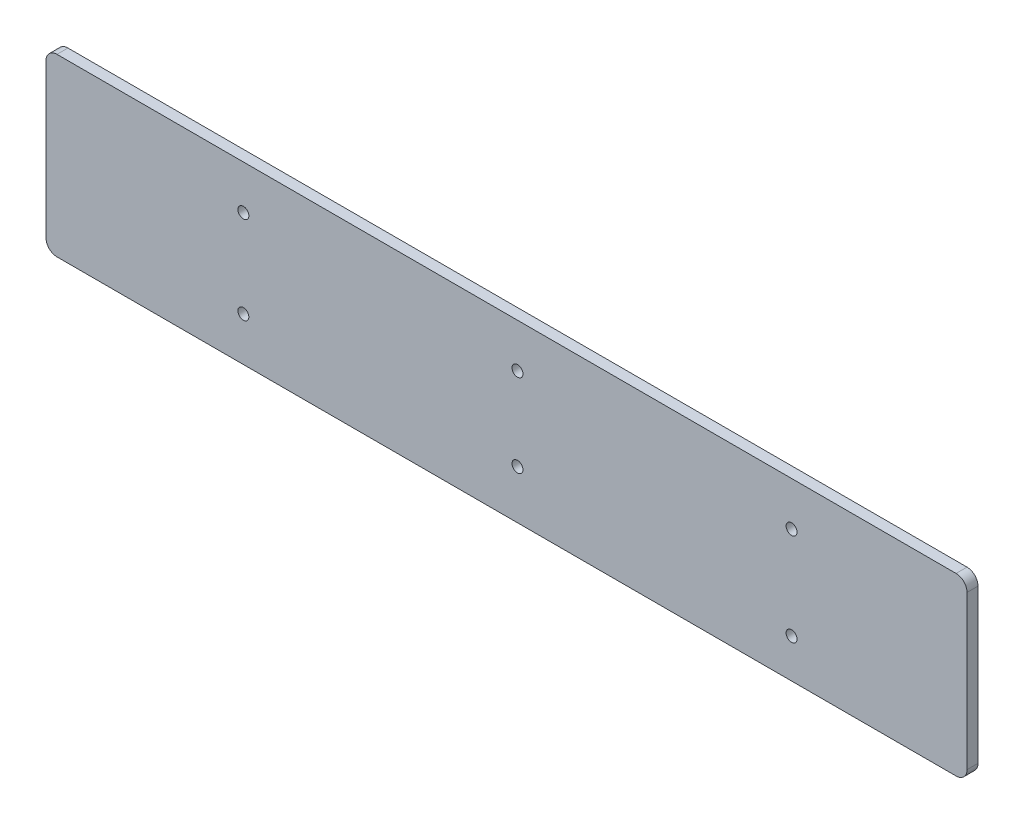
ISO-10303-21;
HEADER;
FILE_DESCRIPTION(('STEP AP214'),'2;1');
FILE_NAME('part.step','',(''),(''),'','','');
FILE_SCHEMA(('AUTOMOTIVE_DESIGN { 1 0 10303 214 1 1 1 1 }'));
ENDSEC;
DATA;
#1=APPLICATION_CONTEXT('core data for automotive mechanical design processes');
#2=APPLICATION_PROTOCOL_DEFINITION('international standard','automotive_design',2000,#1);
#3=PRODUCT_CONTEXT('',#1,'mechanical');
#4=PRODUCT('Part','Part','',(#3));
#5=PRODUCT_RELATED_PRODUCT_CATEGORY('part','',(#4));
#6=PRODUCT_DEFINITION_FORMATION('','',#4);
#7=PRODUCT_DEFINITION_CONTEXT('part definition',#1,'design');
#8=PRODUCT_DEFINITION('design','',#6,#7);
#9=PRODUCT_DEFINITION_SHAPE('','',#8);
#10=(LENGTH_UNIT() NAMED_UNIT(*) SI_UNIT(.MILLI.,.METRE.));
#11=(NAMED_UNIT(*) PLANE_ANGLE_UNIT() SI_UNIT($,.RADIAN.));
#12=(NAMED_UNIT(*) SI_UNIT($,.STERADIAN.) SOLID_ANGLE_UNIT());
#13=UNCERTAINTY_MEASURE_WITH_UNIT(LENGTH_MEASURE(1.E-05),#10,'distance_accuracy_value','');
#14=(GEOMETRIC_REPRESENTATION_CONTEXT(3) GLOBAL_UNCERTAINTY_ASSIGNED_CONTEXT((#13)) GLOBAL_UNIT_ASSIGNED_CONTEXT((#10,
#11,#12)) REPRESENTATION_CONTEXT('',''));
#15=CARTESIAN_POINT('',(0.,0.,0.));
#16=DIRECTION('',(0.,0.,1.));
#17=DIRECTION('',(1.,0.,0.));
#18=AXIS2_PLACEMENT_3D('',#15,#16,#17);
#19=CARTESIAN_POINT('',(0.,0.,5.));
#20=DIRECTION('',(0.,0.,1.));
#21=DIRECTION('',(1.,0.,0.));
#22=AXIS2_PLACEMENT_3D('',#19,#20,#21);
#23=PLANE('',#22);
#24=CARTESIAN_POINT('',(127.5093021123,8.85577866508089,5.));
#25=DIRECTION('',(0.,0.,1.));
#26=DIRECTION('',(1.,0.,0.));
#27=AXIS2_PLACEMENT_3D('',#24,#25,#26);
#28=CIRCLE('',#27,2.5);
#29=CARTESIAN_POINT('',(130.0093021123,8.85577866508089,5.));
#30=VERTEX_POINT('',#29);
#31=EDGE_CURVE('E195',#30,#30,#28,.T.);
#32=ORIENTED_EDGE('',*,*,#31,.F.);
#33=EDGE_LOOP('',(#32));
#34=FACE_BOUND('',#33,.T.);
#35=CARTESIAN_POINT('',(2.50930211230035,8.85577866508089,5.));
#36=DIRECTION('',(0.,0.,1.));
#37=DIRECTION('',(1.,0.,0.));
#38=AXIS2_PLACEMENT_3D('',#35,#36,#37);
#39=CIRCLE('',#38,2.49999999999999);
#40=CARTESIAN_POINT('',(5.00930211230035,8.85577866508089,5.));
#41=VERTEX_POINT('',#40);
#42=EDGE_CURVE('E183',#41,#41,#39,.T.);
#43=ORIENTED_EDGE('',*,*,#42,.F.);
#44=EDGE_LOOP('',(#43));
#45=FACE_BOUND('',#44,.T.);
#46=CARTESIAN_POINT('',(-122.4906978877,-31.1442213349191,5.));
#47=DIRECTION('',(0.,0.,1.));
#48=DIRECTION('',(1.,0.,0.));
#49=AXIS2_PLACEMENT_3D('',#46,#47,#48);
#50=CIRCLE('',#49,2.5);
#51=CARTESIAN_POINT('',(-119.9906978877,-31.1442213349191,5.));
#52=VERTEX_POINT('',#51);
#53=EDGE_CURVE('E166',#52,#52,#50,.T.);
#54=ORIENTED_EDGE('',*,*,#53,.F.);
#55=EDGE_LOOP('',(#54));
#56=FACE_BOUND('',#55,.T.);
#57=DIRECTION('',(1.,0.,0.));
#58=VECTOR('',#57,1.);
#59=CARTESIAN_POINT('',(207.5093021123,-51.1442213349191,5.));
#60=LINE('',#59,#58);
#61=CARTESIAN_POINT('',(-207.4906978877,-51.1442213349191,5.));
#62=VERTEX_POINT('',#61);
#63=CARTESIAN_POINT('',(202.5093021123,-51.1442213349191,5.));
#64=VERTEX_POINT('',#63);
#65=EDGE_CURVE('E173',#62,#64,#60,.T.);
#66=ORIENTED_EDGE('',*,*,#65,.T.);
#67=CARTESIAN_POINT('',(202.5093021123,-46.1442213349191,5.));
#68=DIRECTION('',(0.,0.,1.));
#69=DIRECTION('',(1.,0.,0.));
#70=AXIS2_PLACEMENT_3D('',#67,#68,#69);
#71=CIRCLE('',#70,5.);
#72=CARTESIAN_POINT('',(207.5093021123,-46.1442213349191,5.));
#73=VERTEX_POINT('',#72);
#74=EDGE_CURVE('E150',#64,#73,#71,.T.);
#75=ORIENTED_EDGE('',*,*,#74,.T.);
#76=DIRECTION('',(0.,1.,0.));
#77=VECTOR('',#76,1.);
#78=CARTESIAN_POINT('',(207.5093021123,-51.1442213349191,5.));
#79=LINE('',#78,#77);
#80=CARTESIAN_POINT('',(207.5093021123,23.8557786650809,5.));
#81=VERTEX_POINT('',#80);
#82=EDGE_CURVE('E120',#73,#81,#79,.T.);
#83=ORIENTED_EDGE('',*,*,#82,.T.);
#84=CARTESIAN_POINT('',(202.5093021123,23.8557786650809,5.));
#85=DIRECTION('',(0.,0.,1.));
#86=DIRECTION('',(1.,0.,0.));
#87=AXIS2_PLACEMENT_3D('',#84,#85,#86);
#88=CIRCLE('',#87,5.);
#89=CARTESIAN_POINT('',(202.5093021123,28.8557786650809,5.));
#90=VERTEX_POINT('',#89);
#91=EDGE_CURVE('E57',#81,#90,#88,.T.);
#92=ORIENTED_EDGE('',*,*,#91,.T.);
#93=DIRECTION('',(-1.,0.,0.));
#94=VECTOR('',#93,1.);
#95=CARTESIAN_POINT('',(207.5093021123,28.8557786650809,5.));
#96=LINE('',#95,#94);
#97=CARTESIAN_POINT('',(-207.4906978877,28.8557786650809,5.));
#98=VERTEX_POINT('',#97);
#99=EDGE_CURVE('E136',#90,#98,#96,.T.);
#100=ORIENTED_EDGE('',*,*,#99,.T.);
#101=CARTESIAN_POINT('',(-207.4906978877,23.8557786650809,5.));
#102=DIRECTION('',(0.,0.,1.));
#103=DIRECTION('',(1.,0.,0.));
#104=AXIS2_PLACEMENT_3D('',#101,#102,#103);
#105=CIRCLE('',#104,5.);
#106=CARTESIAN_POINT('',(-212.4906978877,23.8557786650809,5.));
#107=VERTEX_POINT('',#106);
#108=EDGE_CURVE('E145',#98,#107,#105,.T.);
#109=ORIENTED_EDGE('',*,*,#108,.T.);
#110=DIRECTION('',(0.,-1.,0.));
#111=VECTOR('',#110,1.);
#112=CARTESIAN_POINT('',(-212.4906978877,-51.1442213349191,5.));
#113=LINE('',#112,#111);
#114=CARTESIAN_POINT('',(-212.4906978877,-46.1442213349191,5.));
#115=VERTEX_POINT('',#114);
#116=EDGE_CURVE('E130',#107,#115,#113,.T.);
#117=ORIENTED_EDGE('',*,*,#116,.T.);
#118=CARTESIAN_POINT('',(-207.4906978877,-46.1442213349191,5.));
#119=DIRECTION('',(0.,0.,1.));
#120=DIRECTION('',(1.,0.,0.));
#121=AXIS2_PLACEMENT_3D('',#118,#119,#120);
#122=CIRCLE('',#121,5.);
#123=EDGE_CURVE('E147',#115,#62,#122,.T.);
#124=ORIENTED_EDGE('',*,*,#123,.T.);
#125=EDGE_LOOP('',(#66,#75,#83,#92,#100,#109,#117,#124));
#126=FACE_BOUND('',#125,.T.);
#127=CARTESIAN_POINT('',(-122.4906978877,8.85577866508089,5.));
#128=DIRECTION('',(0.,0.,1.));
#129=DIRECTION('',(1.,0.,0.));
#130=AXIS2_PLACEMENT_3D('',#127,#128,#129);
#131=CIRCLE('',#130,2.5);
#132=CARTESIAN_POINT('',(-119.9906978877,8.85577866508089,5.));
#133=VERTEX_POINT('',#132);
#134=EDGE_CURVE('E178',#133,#133,#131,.T.);
#135=ORIENTED_EDGE('',*,*,#134,.F.);
#136=EDGE_LOOP('',(#135));
#137=FACE_BOUND('',#136,.T.);
#138=CARTESIAN_POINT('',(2.50930211230035,-28.9787694783695,5.));
#139=DIRECTION('',(0.,0.,1.));
#140=DIRECTION('',(1.,0.,0.));
#141=AXIS2_PLACEMENT_3D('',#138,#139,#140);
#142=CIRCLE('',#141,2.49999999999999);
#143=CARTESIAN_POINT('',(5.00930211230035,-28.9787694783695,5.));
#144=VERTEX_POINT('',#143);
#145=EDGE_CURVE('E189',#144,#144,#142,.T.);
#146=ORIENTED_EDGE('',*,*,#145,.F.);
#147=EDGE_LOOP('',(#146));
#148=FACE_BOUND('',#147,.T.);
#149=CARTESIAN_POINT('',(127.5093021123,-33.3611786770105,5.));
#150=DIRECTION('',(0.,0.,1.));
#151=DIRECTION('',(1.,0.,0.));
#152=AXIS2_PLACEMENT_3D('',#149,#150,#151);
#153=CIRCLE('',#152,2.5);
#154=CARTESIAN_POINT('',(130.0093021123,-33.3611786770105,5.));
#155=VERTEX_POINT('',#154);
#156=EDGE_CURVE('E201',#155,#155,#153,.T.);
#157=ORIENTED_EDGE('',*,*,#156,.F.);
#158=EDGE_LOOP('',(#157));
#159=FACE_BOUND('',#158,.T.);
#160=ADVANCED_FACE('F35',(#34,#45,#56,#126,#137,#148,#159),#23,.T.);
#161=CARTESIAN_POINT('',(0.,0.,0.));
#162=DIRECTION('',(0.,0.,1.));
#163=DIRECTION('',(1.,0.,0.));
#164=AXIS2_PLACEMENT_3D('',#161,#162,#163);
#165=PLANE('',#164);
#166=DIRECTION('',(0.,1.,0.));
#167=VECTOR('',#166,1.);
#168=CARTESIAN_POINT('',(207.5093021123,-51.1442213349191,0.));
#169=LINE('',#168,#167);
#170=CARTESIAN_POINT('',(207.5093021123,-46.1442213349191,0.));
#171=VERTEX_POINT('',#170);
#172=CARTESIAN_POINT('',(207.5093021123,23.8557786650809,0.));
#173=VERTEX_POINT('',#172);
#174=EDGE_CURVE('E118',#171,#173,#169,.T.);
#175=ORIENTED_EDGE('',*,*,#174,.F.);
#176=CARTESIAN_POINT('',(202.5093021123,-46.1442213349191,0.));
#177=DIRECTION('',(0.,0.,1.));
#178=DIRECTION('',(1.,0.,0.));
#179=AXIS2_PLACEMENT_3D('',#176,#177,#178);
#180=CIRCLE('',#179,5.);
#181=CARTESIAN_POINT('',(202.5093021123,-51.1442213349191,0.));
#182=VERTEX_POINT('',#181);
#183=EDGE_CURVE('E101',#171,#182,#180,.F.);
#184=ORIENTED_EDGE('',*,*,#183,.T.);
#185=DIRECTION('',(1.,0.,0.));
#186=VECTOR('',#185,1.);
#187=CARTESIAN_POINT('',(207.5093021123,-51.1442213349191,0.));
#188=LINE('',#187,#186);
#189=CARTESIAN_POINT('',(-207.4906978877,-51.1442213349191,0.));
#190=VERTEX_POINT('',#189);
#191=EDGE_CURVE('E128',#190,#182,#188,.T.);
#192=ORIENTED_EDGE('',*,*,#191,.F.);
#193=CARTESIAN_POINT('',(-207.4906978877,-46.1442213349191,0.));
#194=DIRECTION('',(0.,0.,1.));
#195=DIRECTION('',(1.,0.,0.));
#196=AXIS2_PLACEMENT_3D('',#193,#194,#195);
#197=CIRCLE('',#196,5.);
#198=CARTESIAN_POINT('',(-212.4906978877,-46.1442213349191,0.));
#199=VERTEX_POINT('',#198);
#200=EDGE_CURVE('E139',#190,#199,#197,.F.);
#201=ORIENTED_EDGE('',*,*,#200,.T.);
#202=DIRECTION('',(0.,-1.,0.));
#203=VECTOR('',#202,1.);
#204=CARTESIAN_POINT('',(-212.4906978877,-51.1442213349191,0.));
#205=LINE('',#204,#203);
#206=CARTESIAN_POINT('',(-212.4906978877,23.8557786650809,0.));
#207=VERTEX_POINT('',#206);
#208=EDGE_CURVE('E132',#207,#199,#205,.T.);
#209=ORIENTED_EDGE('',*,*,#208,.F.);
#210=CARTESIAN_POINT('',(-207.4906978877,23.8557786650809,0.));
#211=DIRECTION('',(0.,0.,1.));
#212=DIRECTION('',(1.,0.,0.));
#213=AXIS2_PLACEMENT_3D('',#210,#211,#212);
#214=CIRCLE('',#213,5.);
#215=CARTESIAN_POINT('',(-207.4906978877,28.8557786650809,0.));
#216=VERTEX_POINT('',#215);
#217=EDGE_CURVE('E121',#207,#216,#214,.F.);
#218=ORIENTED_EDGE('',*,*,#217,.T.);
#219=DIRECTION('',(-1.,0.,0.));
#220=VECTOR('',#219,1.);
#221=CARTESIAN_POINT('',(207.5093021123,28.8557786650809,0.));
#222=LINE('',#221,#220);
#223=CARTESIAN_POINT('',(202.5093021123,28.8557786650809,0.));
#224=VERTEX_POINT('',#223);
#225=EDGE_CURVE('E127',#224,#216,#222,.T.);
#226=ORIENTED_EDGE('',*,*,#225,.F.);
#227=CARTESIAN_POINT('',(202.5093021123,23.8557786650809,0.));
#228=DIRECTION('',(0.,0.,1.));
#229=DIRECTION('',(1.,0.,0.));
#230=AXIS2_PLACEMENT_3D('',#227,#228,#229);
#231=CIRCLE('',#230,5.);
#232=EDGE_CURVE('E112',#224,#173,#231,.F.);
#233=ORIENTED_EDGE('',*,*,#232,.T.);
#234=EDGE_LOOP('',(#175,#184,#192,#201,#209,#218,#226,#233));
#235=FACE_BOUND('',#234,.T.);
#236=CARTESIAN_POINT('',(-122.4906978877,-31.1442213349191,0.));
#237=DIRECTION('',(0.,0.,1.));
#238=DIRECTION('',(1.,0.,0.));
#239=AXIS2_PLACEMENT_3D('',#236,#237,#238);
#240=CIRCLE('',#239,2.5);
#241=CARTESIAN_POINT('',(-119.9906978877,-31.1442213349191,0.));
#242=VERTEX_POINT('',#241);
#243=EDGE_CURVE('E168',#242,#242,#240,.T.);
#244=ORIENTED_EDGE('',*,*,#243,.T.);
#245=EDGE_LOOP('',(#244));
#246=FACE_BOUND('',#245,.T.);
#247=CARTESIAN_POINT('',(-122.4906978877,8.85577866508089,0.));
#248=DIRECTION('',(0.,0.,1.));
#249=DIRECTION('',(1.,0.,0.));
#250=AXIS2_PLACEMENT_3D('',#247,#248,#249);
#251=CIRCLE('',#250,2.5);
#252=CARTESIAN_POINT('',(-119.9906978877,8.85577866508089,0.));
#253=VERTEX_POINT('',#252);
#254=EDGE_CURVE('E180',#253,#253,#251,.T.);
#255=ORIENTED_EDGE('',*,*,#254,.T.);
#256=EDGE_LOOP('',(#255));
#257=FACE_BOUND('',#256,.T.);
#258=CARTESIAN_POINT('',(2.50930211230035,8.85577866508089,0.));
#259=DIRECTION('',(0.,0.,1.));
#260=DIRECTION('',(1.,0.,0.));
#261=AXIS2_PLACEMENT_3D('',#258,#259,#260);
#262=CIRCLE('',#261,2.49999999999999);
#263=CARTESIAN_POINT('',(5.00930211230035,8.85577866508089,0.));
#264=VERTEX_POINT('',#263);
#265=EDGE_CURVE('E186',#264,#264,#262,.T.);
#266=ORIENTED_EDGE('',*,*,#265,.T.);
#267=EDGE_LOOP('',(#266));
#268=FACE_BOUND('',#267,.T.);
#269=CARTESIAN_POINT('',(2.50930211230035,-28.9787694783695,0.));
#270=DIRECTION('',(0.,0.,1.));
#271=DIRECTION('',(1.,0.,0.));
#272=AXIS2_PLACEMENT_3D('',#269,#270,#271);
#273=CIRCLE('',#272,2.49999999999999);
#274=CARTESIAN_POINT('',(5.00930211230035,-28.9787694783695,0.));
#275=VERTEX_POINT('',#274);
#276=EDGE_CURVE('E192',#275,#275,#273,.T.);
#277=ORIENTED_EDGE('',*,*,#276,.T.);
#278=EDGE_LOOP('',(#277));
#279=FACE_BOUND('',#278,.T.);
#280=CARTESIAN_POINT('',(127.5093021123,8.85577866508089,0.));
#281=DIRECTION('',(0.,0.,1.));
#282=DIRECTION('',(1.,0.,0.));
#283=AXIS2_PLACEMENT_3D('',#280,#281,#282);
#284=CIRCLE('',#283,2.5);
#285=CARTESIAN_POINT('',(130.0093021123,8.85577866508089,0.));
#286=VERTEX_POINT('',#285);
#287=EDGE_CURVE('E198',#286,#286,#284,.T.);
#288=ORIENTED_EDGE('',*,*,#287,.T.);
#289=EDGE_LOOP('',(#288));
#290=FACE_BOUND('',#289,.T.);
#291=CARTESIAN_POINT('',(127.5093021123,-33.3611786770105,0.));
#292=DIRECTION('',(0.,0.,1.));
#293=DIRECTION('',(1.,0.,0.));
#294=AXIS2_PLACEMENT_3D('',#291,#292,#293);
#295=CIRCLE('',#294,2.5);
#296=CARTESIAN_POINT('',(130.0093021123,-33.3611786770105,0.));
#297=VERTEX_POINT('',#296);
#298=EDGE_CURVE('E204',#297,#297,#295,.T.);
#299=ORIENTED_EDGE('',*,*,#298,.T.);
#300=EDGE_LOOP('',(#299));
#301=FACE_BOUND('',#300,.T.);
#302=ADVANCED_FACE('F124',(#235,#246,#257,#268,#279,#290,#301),#165,.F.);
#303=CARTESIAN_POINT('',(-212.4906978877,-51.1442213349191,5.));
#304=DIRECTION('',(1.,0.,0.));
#305=DIRECTION('',(0.,0.,-1.));
#306=AXIS2_PLACEMENT_3D('',#303,#304,#305);
#307=PLANE('',#306);
#308=ORIENTED_EDGE('',*,*,#208,.T.);
#309=DIRECTION('',(0.,0.,-1.));
#310=VECTOR('',#309,1.);
#311=CARTESIAN_POINT('',(-212.4906978877,-46.1442213349191,5.));
#312=LINE('',#311,#310);
#313=EDGE_CURVE('E11',#199,#115,#312,.F.);
#314=ORIENTED_EDGE('',*,*,#313,.T.);
#315=ORIENTED_EDGE('',*,*,#116,.F.);
#316=DIRECTION('',(0.,0.,-1.));
#317=VECTOR('',#316,1.);
#318=CARTESIAN_POINT('',(-212.4906978877,23.8557786650809,5.));
#319=LINE('',#318,#317);
#320=EDGE_CURVE('E43',#107,#207,#319,.T.);
#321=ORIENTED_EDGE('',*,*,#320,.T.);
#322=EDGE_LOOP('',(#308,#314,#315,#321));
#323=FACE_BOUND('',#322,.T.);
#324=ADVANCED_FACE('F161',(#323),#307,.F.);
#325=CARTESIAN_POINT('',(207.5093021123,-51.1442213349191,5.));
#326=DIRECTION('',(0.,1.,0.));
#327=DIRECTION('',(-1.,0.,0.));
#328=AXIS2_PLACEMENT_3D('',#325,#326,#327);
#329=PLANE('',#328);
#330=ORIENTED_EDGE('',*,*,#191,.T.);
#331=DIRECTION('',(0.,0.,-1.));
#332=VECTOR('',#331,1.);
#333=CARTESIAN_POINT('',(202.5093021123,-51.1442213349191,5.));
#334=LINE('',#333,#332);
#335=EDGE_CURVE('E106',#182,#64,#334,.F.);
#336=ORIENTED_EDGE('',*,*,#335,.T.);
#337=ORIENTED_EDGE('',*,*,#65,.F.);
#338=DIRECTION('',(0.,0.,-1.));
#339=VECTOR('',#338,1.);
#340=CARTESIAN_POINT('',(-207.4906978877,-51.1442213349191,5.));
#341=LINE('',#340,#339);
#342=EDGE_CURVE('E111',#62,#190,#341,.T.);
#343=ORIENTED_EDGE('',*,*,#342,.T.);
#344=EDGE_LOOP('',(#330,#336,#337,#343));
#345=FACE_BOUND('',#344,.T.);
#346=ADVANCED_FACE('F231',(#345),#329,.F.);
#347=CARTESIAN_POINT('',(207.5093021123,-51.1442213349191,5.));
#348=DIRECTION('',(-1.,0.,0.));
#349=DIRECTION('',(0.,-1.,0.));
#350=AXIS2_PLACEMENT_3D('',#347,#348,#349);
#351=PLANE('',#350);
#352=ORIENTED_EDGE('',*,*,#82,.F.);
#353=DIRECTION('',(0.,0.,-1.));
#354=VECTOR('',#353,1.);
#355=CARTESIAN_POINT('',(207.5093021123,-46.1442213349191,5.));
#356=LINE('',#355,#354);
#357=EDGE_CURVE('E105',#73,#171,#356,.T.);
#358=ORIENTED_EDGE('',*,*,#357,.T.);
#359=ORIENTED_EDGE('',*,*,#174,.T.);
#360=DIRECTION('',(0.,0.,-1.));
#361=VECTOR('',#360,1.);
#362=CARTESIAN_POINT('',(207.5093021123,23.8557786650809,5.));
#363=LINE('',#362,#361);
#364=EDGE_CURVE('E122',#173,#81,#363,.F.);
#365=ORIENTED_EDGE('',*,*,#364,.T.);
#366=EDGE_LOOP('',(#352,#358,#359,#365));
#367=FACE_BOUND('',#366,.T.);
#368=ADVANCED_FACE('F117',(#367),#351,.F.);
#369=CARTESIAN_POINT('',(207.5093021123,28.8557786650809,5.));
#370=DIRECTION('',(0.,-1.,0.));
#371=DIRECTION('',(0.,0.,-1.));
#372=AXIS2_PLACEMENT_3D('',#369,#370,#371);
#373=PLANE('',#372);
#374=ORIENTED_EDGE('',*,*,#99,.F.);
#375=DIRECTION('',(0.,0.,-1.));
#376=VECTOR('',#375,1.);
#377=CARTESIAN_POINT('',(202.5093021123,28.8557786650809,5.));
#378=LINE('',#377,#376);
#379=EDGE_CURVE('E153',#90,#224,#378,.T.);
#380=ORIENTED_EDGE('',*,*,#379,.T.);
#381=ORIENTED_EDGE('',*,*,#225,.T.);
#382=DIRECTION('',(0.,0.,-1.));
#383=VECTOR('',#382,1.);
#384=CARTESIAN_POINT('',(-207.4906978877,28.8557786650809,5.));
#385=LINE('',#384,#383);
#386=EDGE_CURVE('E50',#216,#98,#385,.F.);
#387=ORIENTED_EDGE('',*,*,#386,.T.);
#388=EDGE_LOOP('',(#374,#380,#381,#387));
#389=FACE_BOUND('',#388,.T.);
#390=ADVANCED_FACE('F226',(#389),#373,.F.);
#391=CARTESIAN_POINT('',(-122.4906978877,-31.1442213349191,5.));
#392=DIRECTION('',(0.,0.,-1.));
#393=DIRECTION('',(-1.,0.,0.));
#394=AXIS2_PLACEMENT_3D('',#391,#392,#393);
#395=CYLINDRICAL_SURFACE('',#394,2.5);
#396=ORIENTED_EDGE('',*,*,#53,.T.);
#397=EDGE_LOOP('',(#396));
#398=FACE_BOUND('',#397,.T.);
#399=ORIENTED_EDGE('',*,*,#243,.F.);
#400=EDGE_LOOP('',(#399));
#401=FACE_BOUND('',#400,.T.);
#402=ADVANCED_FACE('F223',(#398,#401),#395,.F.);
#403=CARTESIAN_POINT('',(-122.4906978877,8.85577866508089,5.));
#404=DIRECTION('',(0.,0.,-1.));
#405=DIRECTION('',(-1.,0.,0.));
#406=AXIS2_PLACEMENT_3D('',#403,#404,#405);
#407=CYLINDRICAL_SURFACE('',#406,2.5);
#408=ORIENTED_EDGE('',*,*,#134,.T.);
#409=EDGE_LOOP('',(#408));
#410=FACE_BOUND('',#409,.T.);
#411=ORIENTED_EDGE('',*,*,#254,.F.);
#412=EDGE_LOOP('',(#411));
#413=FACE_BOUND('',#412,.T.);
#414=ADVANCED_FACE('F278',(#410,#413),#407,.F.);
#415=CARTESIAN_POINT('',(2.50930211230035,8.85577866508089,5.));
#416=DIRECTION('',(0.,0.,-1.));
#417=DIRECTION('',(-1.,0.,0.));
#418=AXIS2_PLACEMENT_3D('',#415,#416,#417);
#419=CYLINDRICAL_SURFACE('',#418,2.49999999999999);
#420=ORIENTED_EDGE('',*,*,#42,.T.);
#421=EDGE_LOOP('',(#420));
#422=FACE_BOUND('',#421,.T.);
#423=ORIENTED_EDGE('',*,*,#265,.F.);
#424=EDGE_LOOP('',(#423));
#425=FACE_BOUND('',#424,.T.);
#426=ADVANCED_FACE('F261',(#422,#425),#419,.F.);
#427=CARTESIAN_POINT('',(2.50930211230035,-28.9787694783695,5.));
#428=DIRECTION('',(0.,0.,-1.));
#429=DIRECTION('',(-1.,0.,0.));
#430=AXIS2_PLACEMENT_3D('',#427,#428,#429);
#431=CYLINDRICAL_SURFACE('',#430,2.49999999999999);
#432=ORIENTED_EDGE('',*,*,#145,.T.);
#433=EDGE_LOOP('',(#432));
#434=FACE_BOUND('',#433,.T.);
#435=ORIENTED_EDGE('',*,*,#276,.F.);
#436=EDGE_LOOP('',(#435));
#437=FACE_BOUND('',#436,.T.);
#438=ADVANCED_FACE('F257',(#434,#437),#431,.F.);
#439=CARTESIAN_POINT('',(127.5093021123,8.85577866508089,5.));
#440=DIRECTION('',(0.,0.,-1.));
#441=DIRECTION('',(-1.,0.,0.));
#442=AXIS2_PLACEMENT_3D('',#439,#440,#441);
#443=CYLINDRICAL_SURFACE('',#442,2.5);
#444=ORIENTED_EDGE('',*,*,#31,.T.);
#445=EDGE_LOOP('',(#444));
#446=FACE_BOUND('',#445,.T.);
#447=ORIENTED_EDGE('',*,*,#287,.F.);
#448=EDGE_LOOP('',(#447));
#449=FACE_BOUND('',#448,.T.);
#450=ADVANCED_FACE('F260',(#446,#449),#443,.F.);
#451=CARTESIAN_POINT('',(127.5093021123,-33.3611786770105,5.));
#452=DIRECTION('',(0.,0.,-1.));
#453=DIRECTION('',(-1.,0.,0.));
#454=AXIS2_PLACEMENT_3D('',#451,#452,#453);
#455=CYLINDRICAL_SURFACE('',#454,2.5);
#456=ORIENTED_EDGE('',*,*,#156,.T.);
#457=EDGE_LOOP('',(#456));
#458=FACE_BOUND('',#457,.T.);
#459=ORIENTED_EDGE('',*,*,#298,.F.);
#460=EDGE_LOOP('',(#459));
#461=FACE_BOUND('',#460,.T.);
#462=ADVANCED_FACE('F210',(#458,#461),#455,.F.);
#463=CARTESIAN_POINT('',(202.5093021123,-46.1442213349191,5.));
#464=DIRECTION('',(0.,0.,-1.));
#465=DIRECTION('',(-1.,0.,0.));
#466=AXIS2_PLACEMENT_3D('',#463,#464,#465);
#467=CYLINDRICAL_SURFACE('',#466,5.);
#468=ORIENTED_EDGE('',*,*,#74,.F.);
#469=ORIENTED_EDGE('',*,*,#335,.F.);
#470=ORIENTED_EDGE('',*,*,#183,.F.);
#471=ORIENTED_EDGE('',*,*,#357,.F.);
#472=EDGE_LOOP('',(#468,#469,#470,#471));
#473=FACE_BOUND('',#472,.T.);
#474=ADVANCED_FACE('F104',(#473),#467,.T.);
#475=CARTESIAN_POINT('',(202.5093021123,23.8557786650809,5.));
#476=DIRECTION('',(0.,0.,-1.));
#477=DIRECTION('',(-1.,0.,0.));
#478=AXIS2_PLACEMENT_3D('',#475,#476,#477);
#479=CYLINDRICAL_SURFACE('',#478,5.);
#480=ORIENTED_EDGE('',*,*,#91,.F.);
#481=ORIENTED_EDGE('',*,*,#364,.F.);
#482=ORIENTED_EDGE('',*,*,#232,.F.);
#483=ORIENTED_EDGE('',*,*,#379,.F.);
#484=EDGE_LOOP('',(#480,#481,#482,#483));
#485=FACE_BOUND('',#484,.T.);
#486=ADVANCED_FACE('F239',(#485),#479,.T.);
#487=CARTESIAN_POINT('',(-207.4906978877,-46.1442213349191,5.));
#488=DIRECTION('',(0.,0.,-1.));
#489=DIRECTION('',(-1.,0.,0.));
#490=AXIS2_PLACEMENT_3D('',#487,#488,#489);
#491=CYLINDRICAL_SURFACE('',#490,5.);
#492=ORIENTED_EDGE('',*,*,#123,.F.);
#493=ORIENTED_EDGE('',*,*,#313,.F.);
#494=ORIENTED_EDGE('',*,*,#200,.F.);
#495=ORIENTED_EDGE('',*,*,#342,.F.);
#496=EDGE_LOOP('',(#492,#493,#494,#495));
#497=FACE_BOUND('',#496,.T.);
#498=ADVANCED_FACE('F241',(#497),#491,.T.);
#499=CARTESIAN_POINT('',(-207.4906978877,23.8557786650809,5.));
#500=DIRECTION('',(0.,0.,-1.));
#501=DIRECTION('',(-1.,0.,0.));
#502=AXIS2_PLACEMENT_3D('',#499,#500,#501);
#503=CYLINDRICAL_SURFACE('',#502,5.);
#504=ORIENTED_EDGE('',*,*,#108,.F.);
#505=ORIENTED_EDGE('',*,*,#386,.F.);
#506=ORIENTED_EDGE('',*,*,#217,.F.);
#507=ORIENTED_EDGE('',*,*,#320,.F.);
#508=EDGE_LOOP('',(#504,#505,#506,#507));
#509=FACE_BOUND('',#508,.T.);
#510=ADVANCED_FACE('F37',(#509),#503,.T.);
#511=CLOSED_SHELL('',(#160,#302,#324,#346,#368,#390,#402,#414,#426,#438,#450,#462,#474,#486,
#498,#510));
#512=MANIFOLD_SOLID_BREP('B2',#511);
#513=ADVANCED_BREP_SHAPE_REPRESENTATION('',(#18,#512),#14);
#514=SHAPE_DEFINITION_REPRESENTATION(#9,#513);
ENDSEC;
END-ISO-10303-21;
